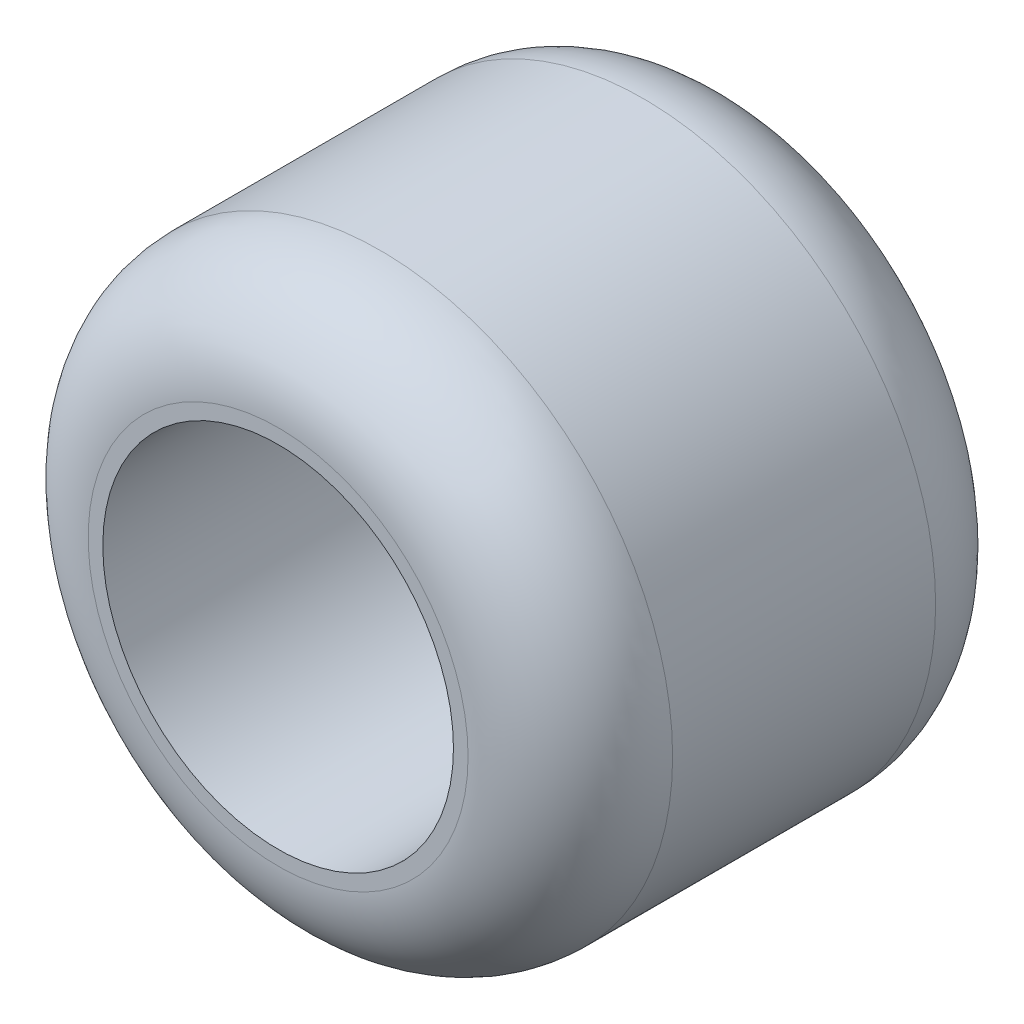
ISO-10303-21;
HEADER;
FILE_DESCRIPTION(('STEP AP214'),'2;1');
FILE_NAME('part.step','',(''),(''),'','','');
FILE_SCHEMA(('AUTOMOTIVE_DESIGN { 1 0 10303 214 1 1 1 1 }'));
ENDSEC;
DATA;
#1=APPLICATION_CONTEXT('core data for automotive mechanical design processes');
#2=APPLICATION_PROTOCOL_DEFINITION('international standard','automotive_design',2000,#1);
#3=PRODUCT_CONTEXT('',#1,'mechanical');
#4=PRODUCT('Part','Part','',(#3));
#5=PRODUCT_RELATED_PRODUCT_CATEGORY('part','',(#4));
#6=PRODUCT_DEFINITION_FORMATION('','',#4);
#7=PRODUCT_DEFINITION_CONTEXT('part definition',#1,'design');
#8=PRODUCT_DEFINITION('design','',#6,#7);
#9=PRODUCT_DEFINITION_SHAPE('','',#8);
#10=(LENGTH_UNIT() NAMED_UNIT(*) SI_UNIT(.MILLI.,.METRE.));
#11=(NAMED_UNIT(*) PLANE_ANGLE_UNIT() SI_UNIT($,.RADIAN.));
#12=(NAMED_UNIT(*) SI_UNIT($,.STERADIAN.) SOLID_ANGLE_UNIT());
#13=UNCERTAINTY_MEASURE_WITH_UNIT(LENGTH_MEASURE(1.E-05),#10,'distance_accuracy_value','');
#14=(GEOMETRIC_REPRESENTATION_CONTEXT(3) GLOBAL_UNCERTAINTY_ASSIGNED_CONTEXT((#13)) GLOBAL_UNIT_ASSIGNED_CONTEXT((#10,
#11,#12)) REPRESENTATION_CONTEXT('',''));
#15=CARTESIAN_POINT('',(0.,0.,0.));
#16=DIRECTION('',(0.,0.,1.));
#17=DIRECTION('',(1.,0.,0.));
#18=AXIS2_PLACEMENT_3D('',#15,#16,#17);
#19=CARTESIAN_POINT('',(0.,0.,8.));
#20=DIRECTION('',(0.,0.,-1.));
#21=DIRECTION('',(-1.,0.,0.));
#22=AXIS2_PLACEMENT_3D('',#19,#20,#21);
#23=CYLINDRICAL_SURFACE('',#22,5.);
#24=CARTESIAN_POINT('',(0.,0.,1.75));
#25=DIRECTION('',(0.,0.,1.));
#26=DIRECTION('',(1.,0.,0.));
#27=AXIS2_PLACEMENT_3D('',#24,#25,#26);
#28=CIRCLE('',#27,5.);
#29=CARTESIAN_POINT('',(5.,0.,1.75));
#30=VERTEX_POINT('',#29);
#31=EDGE_CURVE('E48',#30,#30,#28,.T.);
#32=ORIENTED_EDGE('',*,*,#31,.T.);
#33=EDGE_LOOP('',(#32));
#34=FACE_BOUND('',#33,.T.);
#35=CARTESIAN_POINT('',(0.,0.,6.25));
#36=DIRECTION('',(0.,0.,1.));
#37=DIRECTION('',(1.,0.,0.));
#38=AXIS2_PLACEMENT_3D('',#35,#36,#37);
#39=CIRCLE('',#38,5.);
#40=CARTESIAN_POINT('',(5.,0.,6.25));
#41=VERTEX_POINT('',#40);
#42=EDGE_CURVE('E55',#41,#41,#39,.F.);
#43=ORIENTED_EDGE('',*,*,#42,.T.);
#44=EDGE_LOOP('',(#43));
#45=FACE_BOUND('',#44,.T.);
#46=ADVANCED_FACE('F40',(#34,#45),#23,.T.);
#47=CARTESIAN_POINT('',(0.,0.,8.));
#48=DIRECTION('',(0.,0.,1.));
#49=DIRECTION('',(1.,0.,0.));
#50=AXIS2_PLACEMENT_3D('',#47,#48,#49);
#51=PLANE('',#50);
#52=CARTESIAN_POINT('',(0.,0.,8.));
#53=DIRECTION('',(0.,0.,1.));
#54=DIRECTION('',(1.,0.,0.));
#55=AXIS2_PLACEMENT_3D('',#52,#53,#54);
#56=CIRCLE('',#55,3.25);
#57=CARTESIAN_POINT('',(3.25,0.,8.));
#58=VERTEX_POINT('',#57);
#59=EDGE_CURVE('E10',#58,#58,#56,.T.);
#60=ORIENTED_EDGE('',*,*,#59,.T.);
#61=EDGE_LOOP('',(#60));
#62=FACE_BOUND('',#61,.T.);
#63=CARTESIAN_POINT('',(0.,0.,8.));
#64=DIRECTION('',(0.,0.,1.));
#65=DIRECTION('',(1.,0.,0.));
#66=AXIS2_PLACEMENT_3D('',#63,#64,#65);
#67=CIRCLE('',#66,3.);
#68=CARTESIAN_POINT('',(3.,0.,8.));
#69=VERTEX_POINT('',#68);
#70=EDGE_CURVE('E59',#69,#69,#67,.T.);
#71=ORIENTED_EDGE('',*,*,#70,.F.);
#72=EDGE_LOOP('',(#71));
#73=FACE_BOUND('',#72,.T.);
#74=ADVANCED_FACE('F71',(#62,#73),#51,.T.);
#75=CARTESIAN_POINT('',(0.,0.,0.));
#76=DIRECTION('',(0.,0.,1.));
#77=DIRECTION('',(1.,0.,0.));
#78=AXIS2_PLACEMENT_3D('',#75,#76,#77);
#79=PLANE('',#78);
#80=CARTESIAN_POINT('',(0.,0.,0.));
#81=DIRECTION('',(0.,0.,1.));
#82=DIRECTION('',(1.,0.,0.));
#83=AXIS2_PLACEMENT_3D('',#80,#81,#82);
#84=CIRCLE('',#83,3.25);
#85=CARTESIAN_POINT('',(3.25,0.,0.));
#86=VERTEX_POINT('',#85);
#87=EDGE_CURVE('E42',#86,#86,#84,.F.);
#88=ORIENTED_EDGE('',*,*,#87,.T.);
#89=EDGE_LOOP('',(#88));
#90=FACE_BOUND('',#89,.T.);
#91=CARTESIAN_POINT('',(0.,0.,0.));
#92=DIRECTION('',(0.,0.,1.));
#93=DIRECTION('',(1.,0.,0.));
#94=AXIS2_PLACEMENT_3D('',#91,#92,#93);
#95=CIRCLE('',#94,3.);
#96=CARTESIAN_POINT('',(3.,0.,0.));
#97=VERTEX_POINT('',#96);
#98=EDGE_CURVE('E60',#97,#97,#95,.T.);
#99=ORIENTED_EDGE('',*,*,#98,.T.);
#100=EDGE_LOOP('',(#99));
#101=FACE_BOUND('',#100,.T.);
#102=ADVANCED_FACE('F63',(#90,#101),#79,.F.);
#103=CARTESIAN_POINT('',(0.,0.,0.));
#104=DIRECTION('',(0.,0.,1.));
#105=DIRECTION('',(1.,0.,0.));
#106=AXIS2_PLACEMENT_3D('',#103,#104,#105);
#107=CYLINDRICAL_SURFACE('',#106,3.);
#108=ORIENTED_EDGE('',*,*,#98,.F.);
#109=EDGE_LOOP('',(#108));
#110=FACE_BOUND('',#109,.T.);
#111=ORIENTED_EDGE('',*,*,#70,.T.);
#112=EDGE_LOOP('',(#111));
#113=FACE_BOUND('',#112,.T.);
#114=ADVANCED_FACE('F67',(#110,#113),#107,.F.);
#115=CARTESIAN_POINT('',(0.,0.,1.75));
#116=DIRECTION('',(0.,0.,1.));
#117=DIRECTION('',(1.,0.,0.));
#118=AXIS2_PLACEMENT_3D('',#115,#116,#117);
#119=TOROIDAL_SURFACE('',#118,3.25,1.75);
#120=ORIENTED_EDGE('',*,*,#87,.F.);
#121=EDGE_LOOP('',(#120));
#122=FACE_BOUND('',#121,.T.);
#123=ORIENTED_EDGE('',*,*,#31,.F.);
#124=EDGE_LOOP('',(#123));
#125=FACE_BOUND('',#124,.T.);
#126=ADVANCED_FACE('F69',(#122,#125),#119,.T.);
#127=CARTESIAN_POINT('',(0.,0.,6.25));
#128=DIRECTION('',(0.,0.,1.));
#129=DIRECTION('',(1.,0.,0.));
#130=AXIS2_PLACEMENT_3D('',#127,#128,#129);
#131=TOROIDAL_SURFACE('',#130,3.25,1.75);
#132=ORIENTED_EDGE('',*,*,#42,.F.);
#133=EDGE_LOOP('',(#132));
#134=FACE_BOUND('',#133,.T.);
#135=ORIENTED_EDGE('',*,*,#59,.F.);
#136=EDGE_LOOP('',(#135));
#137=FACE_BOUND('',#136,.T.);
#138=ADVANCED_FACE('F39',(#134,#137),#131,.T.);
#139=CLOSED_SHELL('',(#46,#74,#102,#114,#126,#138));
#140=MANIFOLD_SOLID_BREP('B2',#139);
#141=ADVANCED_BREP_SHAPE_REPRESENTATION('',(#18,#140),#14);
#142=SHAPE_DEFINITION_REPRESENTATION(#9,#141);
ENDSEC;
END-ISO-10303-21;
